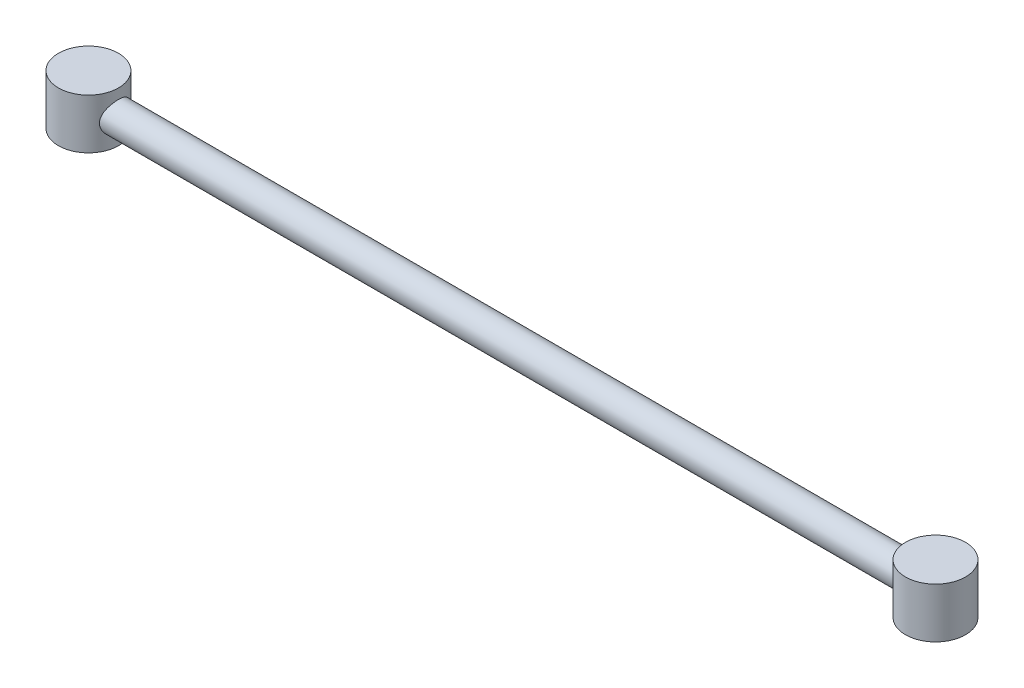
ISO-10303-21;
HEADER;
FILE_DESCRIPTION(('STEP AP214'),'2;1');
FILE_NAME('part.step','',(''),(''),'','','');
FILE_SCHEMA(('AUTOMOTIVE_DESIGN { 1 0 10303 214 1 1 1 1 }'));
ENDSEC;
DATA;
#1=APPLICATION_CONTEXT('core data for automotive mechanical design processes');
#2=APPLICATION_PROTOCOL_DEFINITION('international standard','automotive_design',2000,#1);
#3=PRODUCT_CONTEXT('',#1,'mechanical');
#4=PRODUCT('Part','Part','',(#3));
#5=PRODUCT_RELATED_PRODUCT_CATEGORY('part','',(#4));
#6=PRODUCT_DEFINITION_FORMATION('','',#4);
#7=PRODUCT_DEFINITION_CONTEXT('part definition',#1,'design');
#8=PRODUCT_DEFINITION('design','',#6,#7);
#9=PRODUCT_DEFINITION_SHAPE('','',#8);
#10=(LENGTH_UNIT() NAMED_UNIT(*) SI_UNIT(.MILLI.,.METRE.));
#11=(NAMED_UNIT(*) PLANE_ANGLE_UNIT() SI_UNIT($,.RADIAN.));
#12=(NAMED_UNIT(*) SI_UNIT($,.STERADIAN.) SOLID_ANGLE_UNIT());
#13=UNCERTAINTY_MEASURE_WITH_UNIT(LENGTH_MEASURE(1.E-05),#10,'distance_accuracy_value','');
#14=(GEOMETRIC_REPRESENTATION_CONTEXT(3) GLOBAL_UNCERTAINTY_ASSIGNED_CONTEXT((#13)) GLOBAL_UNIT_ASSIGNED_CONTEXT((#10,
#11,#12)) REPRESENTATION_CONTEXT('',''));
#15=CARTESIAN_POINT('',(0.,0.,0.));
#16=DIRECTION('',(0.,0.,1.));
#17=DIRECTION('',(1.,0.,0.));
#18=AXIS2_PLACEMENT_3D('',#15,#16,#17);
#19=CARTESIAN_POINT('',(-3.175,1.27,0.));
#20=DIRECTION('',(0.,1.,0.));
#21=DIRECTION('',(0.,0.,1.));
#22=AXIS2_PLACEMENT_3D('',#19,#20,#21);
#23=PLANE('',#22);
#24=DIRECTION('',(1.,0.,0.));
#25=VECTOR('',#24,1.);
#26=CARTESIAN_POINT('',(-500000.,1.27,-9.43995365454725));
#27=LINE('',#26,#25);
#28=CARTESIAN_POINT('',(-3.17499999999882,1.27,-9.43995365454725));
#29=VERTEX_POINT('',#28);
#30=CARTESIAN_POINT('',(3.17499999999882,1.27,-9.43995365454725));
#31=VERTEX_POINT('',#30);
#32=EDGE_CURVE('E152',#29,#31,#27,.T.);
#33=ORIENTED_EDGE('',*,*,#32,.T.);
#34=DIRECTION('',(0.,0.,1.));
#35=VECTOR('',#34,1.);
#36=CARTESIAN_POINT('',(3.175,1.27,0.));
#37=LINE('',#36,#35);
#38=CARTESIAN_POINT('',(3.175,1.27,0.));
#39=VERTEX_POINT('',#38);
#40=EDGE_CURVE('E48',#31,#39,#37,.T.);
#41=ORIENTED_EDGE('',*,*,#40,.T.);
#42=DIRECTION('',(1.,0.,0.));
#43=VECTOR('',#42,1.);
#44=CARTESIAN_POINT('',(-3.175,1.27,0.));
#45=LINE('',#44,#43);
#46=CARTESIAN_POINT('',(-3.175,1.27,0.));
#47=VERTEX_POINT('',#46);
#48=EDGE_CURVE('E83',#47,#39,#45,.T.);
#49=ORIENTED_EDGE('',*,*,#48,.F.);
#50=DIRECTION('',(0.,0.,1.));
#51=VECTOR('',#50,1.);
#52=CARTESIAN_POINT('',(-3.175,1.27,0.));
#53=LINE('',#52,#51);
#54=EDGE_CURVE('E84',#29,#47,#53,.T.);
#55=ORIENTED_EDGE('',*,*,#54,.F.);
#56=EDGE_LOOP('',(#33,#41,#49,#55));
#57=FACE_BOUND('',#56,.T.);
#58=CARTESIAN_POINT('',(0.,1.26999999997679,-6.29166923465618));
#59=DIRECTION('',(0.,1.,0.));
#60=DIRECTION('',(0.,0.,1.));
#61=AXIS2_PLACEMENT_3D('',#58,#59,#60);
#62=CIRCLE('',#61,1.27);
#63=CARTESIAN_POINT('',(0.,1.26999999997679,-7.56166923465618));
#64=VERTEX_POINT('',#63);
#65=EDGE_CURVE('E11',#64,#64,#62,.F.);
#66=ORIENTED_EDGE('',*,*,#65,.F.);
#67=EDGE_LOOP('',(#66));
#68=FACE_BOUND('',#67,.T.);
#69=ADVANCED_FACE('F33',(#57,#68),#23,.F.);
#70=CARTESIAN_POINT('',(-3.175,-1.27,0.));
#71=DIRECTION('',(0.,-1.,0.));
#72=DIRECTION('',(0.,0.,-1.));
#73=AXIS2_PLACEMENT_3D('',#70,#71,#72);
#74=PLANE('',#73);
#75=DIRECTION('',(1.,0.,0.));
#76=VECTOR('',#75,1.);
#77=CARTESIAN_POINT('',(-500000.,-1.27,-9.43995365454725));
#78=LINE('',#77,#76);
#79=CARTESIAN_POINT('',(3.17499999999882,-1.27,-9.43995365454725));
#80=VERTEX_POINT('',#79);
#81=CARTESIAN_POINT('',(-3.17499999999882,-1.27,-9.43995365454725));
#82=VERTEX_POINT('',#81);
#83=EDGE_CURVE('E56',#80,#82,#78,.F.);
#84=ORIENTED_EDGE('',*,*,#83,.T.);
#85=DIRECTION('',(0.,0.,-1.));
#86=VECTOR('',#85,1.);
#87=CARTESIAN_POINT('',(-3.175,-1.27,0.));
#88=LINE('',#87,#86);
#89=CARTESIAN_POINT('',(-3.175,-1.27,0.));
#90=VERTEX_POINT('',#89);
#91=EDGE_CURVE('E86',#90,#82,#88,.T.);
#92=ORIENTED_EDGE('',*,*,#91,.F.);
#93=DIRECTION('',(1.,0.,0.));
#94=VECTOR('',#93,1.);
#95=CARTESIAN_POINT('',(-3.175,-1.27,0.));
#96=LINE('',#95,#94);
#97=CARTESIAN_POINT('',(3.175,-1.27,0.));
#98=VERTEX_POINT('',#97);
#99=EDGE_CURVE('E76',#90,#98,#96,.T.);
#100=ORIENTED_EDGE('',*,*,#99,.T.);
#101=DIRECTION('',(0.,0.,-1.));
#102=VECTOR('',#101,1.);
#103=CARTESIAN_POINT('',(3.175,-1.27,0.));
#104=LINE('',#103,#102);
#105=EDGE_CURVE('E96',#98,#80,#104,.T.);
#106=ORIENTED_EDGE('',*,*,#105,.T.);
#107=EDGE_LOOP('',(#84,#92,#100,#106));
#108=FACE_BOUND('',#107,.T.);
#109=CARTESIAN_POINT('',(0.,-1.26999999997679,-6.29166923465618));
#110=DIRECTION('',(0.,-1.,0.));
#111=DIRECTION('',(0.,0.,-1.));
#112=AXIS2_PLACEMENT_3D('',#109,#110,#111);
#113=CIRCLE('',#112,1.27);
#114=CARTESIAN_POINT('',(0.,-1.26999999997679,-7.56166923465618));
#115=VERTEX_POINT('',#114);
#116=EDGE_CURVE('E41',#115,#115,#113,.F.);
#117=ORIENTED_EDGE('',*,*,#116,.F.);
#118=EDGE_LOOP('',(#117));
#119=FACE_BOUND('',#118,.T.);
#120=ADVANCED_FACE('F87',(#108,#119),#74,.F.);
#121=CARTESIAN_POINT('',(268.478,-15.875,0.));
#122=DIRECTION('',(0.,1.,0.));
#123=DIRECTION('',(0.,0.,1.));
#124=AXIS2_PLACEMENT_3D('',#121,#122,#123);
#125=PLANE('',#124);
#126=CARTESIAN_POINT('',(268.478,-15.875,0.));
#127=DIRECTION('',(0.,-1.,0.));
#128=DIRECTION('',(0.,0.,1.));
#129=AXIS2_PLACEMENT_3D('',#126,#127,#128);
#130=CIRCLE('',#129,19.05);
#131=CARTESIAN_POINT('',(268.478,-15.875,19.05));
#132=VERTEX_POINT('',#131);
#133=EDGE_CURVE('E111',#132,#132,#130,.T.);
#134=ORIENTED_EDGE('',*,*,#133,.T.);
#135=EDGE_LOOP('',(#134));
#136=FACE_BOUND('',#135,.T.);
#137=CARTESIAN_POINT('',(268.478,-15.875,0.));
#138=DIRECTION('',(0.,1.,0.));
#139=DIRECTION('',(0.,0.,1.));
#140=AXIS2_PLACEMENT_3D('',#137,#138,#139);
#141=CIRCLE('',#140,12.7);
#142=CARTESIAN_POINT('',(268.478,-15.875,12.7));
#143=VERTEX_POINT('',#142);
#144=EDGE_CURVE('E102',#143,#143,#141,.F.);
#145=ORIENTED_EDGE('',*,*,#144,.F.);
#146=EDGE_LOOP('',(#145));
#147=FACE_BOUND('',#146,.T.);
#148=ADVANCED_FACE('F132',(#136,#147),#125,.F.);
#149=CARTESIAN_POINT('',(-268.478,-15.875,0.));
#150=DIRECTION('',(0.,1.,0.));
#151=DIRECTION('',(0.,0.,1.));
#152=AXIS2_PLACEMENT_3D('',#149,#150,#151);
#153=PLANE('',#152);
#154=CARTESIAN_POINT('',(-268.478,-15.875,0.));
#155=DIRECTION('',(0.,1.,0.));
#156=DIRECTION('',(0.,0.,1.));
#157=AXIS2_PLACEMENT_3D('',#154,#155,#156);
#158=CIRCLE('',#157,19.05);
#159=CARTESIAN_POINT('',(-268.478,-15.875,19.05));
#160=VERTEX_POINT('',#159);
#161=EDGE_CURVE('E165',#160,#160,#158,.T.);
#162=ORIENTED_EDGE('',*,*,#161,.F.);
#163=EDGE_LOOP('',(#162));
#164=FACE_BOUND('',#163,.T.);
#165=CARTESIAN_POINT('',(-268.478,-15.875,0.));
#166=DIRECTION('',(0.,1.,0.));
#167=DIRECTION('',(0.,0.,1.));
#168=AXIS2_PLACEMENT_3D('',#165,#166,#167);
#169=CIRCLE('',#168,12.7);
#170=CARTESIAN_POINT('',(-268.478,-15.875,12.7));
#171=VERTEX_POINT('',#170);
#172=EDGE_CURVE('E112',#171,#171,#169,.F.);
#173=ORIENTED_EDGE('',*,*,#172,.F.);
#174=EDGE_LOOP('',(#173));
#175=FACE_BOUND('',#174,.T.);
#176=ADVANCED_FACE('F184',(#164,#175),#153,.F.);
#177=CARTESIAN_POINT('',(-268.478,15.875,0.));
#178=DIRECTION('',(0.,-1.,0.));
#179=DIRECTION('',(0.,0.,-1.));
#180=AXIS2_PLACEMENT_3D('',#177,#178,#179);
#181=CYLINDRICAL_SURFACE('',#180,19.05);
#182=CARTESIAN_POINT('',(-251.980216057922,0.,-9.525));
#183=CARTESIAN_POINT('',(-251.980214634338,0.248281546165091,-9.52499893158731));
#184=CARTESIAN_POINT('',(-251.974592178614,0.496584709663516,-9.5152793854479));
#185=CARTESIAN_POINT('',(-251.952311035366,0.991277681960141,-9.47652846767449));
#186=CARTESIAN_POINT('',(-251.935647209922,1.23766654594224,-9.44748810539008));
#187=CARTESIAN_POINT('',(-251.891872870738,1.72690457641127,-9.37042405876415));
#188=CARTESIAN_POINT('',(-251.86474597588,1.96974756957878,-9.32237060421729));
#189=CARTESIAN_POINT('',(-251.80100646524,2.44987713557215,-9.2078592239572));
#190=CARTESIAN_POINT('',(-251.764389724928,2.68716124334515,-9.14139329483979));
#191=CARTESIAN_POINT('',(-251.683139350428,3.15322618190933,-8.99123962648128));
#192=CARTESIAN_POINT('',(-251.638553364395,3.38204829384444,-8.90765383569051));
#193=CARTESIAN_POINT('',(-251.542566438745,3.8314829025366,-8.7237802435713));
#194=CARTESIAN_POINT('',(-251.491163029294,4.05209238672965,-8.6234863858136));
#195=CARTESIAN_POINT('',(-251.383004605287,4.48393698188996,-8.40703629023968));
#196=CARTESIAN_POINT('',(-251.326250853952,4.69517428840229,-8.29088379377404));
#197=CARTESIAN_POINT('',(-251.208838616189,5.10745707788947,-8.04346401374653));
#198=CARTESIAN_POINT('',(-251.14818000112,5.3085022247055,-7.91219623211734));
#199=CARTESIAN_POINT('',(-251.019280879606,5.71579775768272,-7.62381683443089));
#200=CARTESIAN_POINT('',(-250.950828148739,5.92110434221265,-7.46546581951747));
#201=CARTESIAN_POINT('',(-250.812843058468,6.31787052737791,-7.1328215507058));
#202=CARTESIAN_POINT('',(-250.743310980617,6.5093336677949,-6.95853239820335));
#203=CARTESIAN_POINT('',(-250.604835542378,6.87766484529038,-6.59472443647305));
#204=CARTESIAN_POINT('',(-250.535892534666,7.0545246226494,-6.40519712647571));
#205=CARTESIAN_POINT('',(-250.400294324002,7.39260099929998,-6.01185007749179));
#206=CARTESIAN_POINT('',(-250.33363946922,7.55381522469563,-5.80802817764742));
#207=CARTESIAN_POINT('',(-250.199844388911,7.86994148490604,-5.37278298407204));
#208=CARTESIAN_POINT('',(-250.132977301563,8.02368632550289,-5.14042525131781));
#209=CARTESIAN_POINT('',(-250.005584842305,8.31082408311721,-4.66193516492724));
#210=CARTESIAN_POINT('',(-249.945056768897,8.44422568096336,-4.41580874826571));
#211=CARTESIAN_POINT('',(-249.832061358994,8.68941833427074,-3.9113001615552));
#212=CARTESIAN_POINT('',(-249.779592062002,8.80121464746687,-3.65292099237303));
#213=CARTESIAN_POINT('',(-249.684274572532,9.00194699005801,-3.12571719778882));
#214=CARTESIAN_POINT('',(-249.641425358192,9.09088544760324,-2.85689368536654));
#215=CARTESIAN_POINT('',(-249.569345188921,9.23927740795149,-2.33040190392418));
#216=CARTESIAN_POINT('',(-249.539362310807,9.30037830763904,-2.07330045246555));
#217=CARTESIAN_POINT('',(-249.489693097287,9.40110896147763,-1.55394008606448));
#218=CARTESIAN_POINT('',(-249.470006314213,9.44073964914621,-1.29168139587093));
#219=CARTESIAN_POINT('',(-249.441508350909,9.4979869279131,-0.76431852253068));
#220=CARTESIAN_POINT('',(-249.432691628503,9.51561473739145,-0.49921585901119));
#221=CARTESIAN_POINT('',(-249.426177295126,9.52864676705275,0.0316650576844548));
#222=CARTESIAN_POINT('',(-249.428479003872,9.52405234690619,0.297443268532658));
#223=CARTESIAN_POINT('',(-249.443445830691,9.49407808105549,0.804258022659698));
#224=CARTESIAN_POINT('',(-249.455191009603,9.47054314914934,1.04543361409006));
#225=CARTESIAN_POINT('',(-249.487594508987,9.40528730170593,1.52468793779052));
#226=CARTESIAN_POINT('',(-249.508252201943,9.36356766652482,1.76276688687513));
#227=CARTESIAN_POINT('',(-249.557986291883,9.262396120129,2.23422861277622));
#228=CARTESIAN_POINT('',(-249.587062963115,9.20294363126585,2.46761123634529));
#229=CARTESIAN_POINT('',(-249.65295673925,9.06691323219252,2.92820475287215));
#230=CARTESIAN_POINT('',(-249.689774122167,8.99033470688245,3.15541542382887));
#231=CARTESIAN_POINT('',(-249.770873428015,8.81960511649784,3.60539471515004));
#232=CARTESIAN_POINT('',(-249.81524992837,8.72522954178945,3.82806111323092));
#233=CARTESIAN_POINT('',(-249.910124238517,8.52040758485652,4.26455898990727));
#234=CARTESIAN_POINT('',(-249.96062421704,8.40995550608297,4.47838730218702));
#235=CARTESIAN_POINT('',(-250.119695847882,8.05575473491029,5.10494218255635));
#236=CARTESIAN_POINT('',(-250.235890071647,7.78905769056075,5.50300988352719));
#237=CARTESIAN_POINT('',(-250.49060253376,7.17323939319794,6.28826701689851));
#238=CARTESIAN_POINT('',(-250.630192757884,6.81870984681844,6.67087124951463));
#239=CARTESIAN_POINT('',(-250.839055866412,6.24398190762096,7.1976429664399));
#240=CARTESIAN_POINT('',(-250.908641228975,6.04508700313851,7.36548461300317));
#241=CARTESIAN_POINT('',(-251.04589779904,5.63373015326947,7.68468913396525));
#242=CARTESIAN_POINT('',(-251.113568716143,5.42126616537583,7.83604951817745));
#243=CARTESIAN_POINT('',(-251.249337409067,4.96982713462606,8.1304140821555));
#244=CARTESIAN_POINT('',(-251.317186410535,4.73002555004584,8.27226715358055));
#245=CARTESIAN_POINT('',(-251.446325486983,4.2376242347197,8.5349859642748));
#246=CARTESIAN_POINT('',(-251.50761850808,3.98503032840596,8.65586114589579));
#247=CARTESIAN_POINT('',(-251.621403771724,3.46862123853846,8.87541314764735));
#248=CARTESIAN_POINT('',(-251.673901212293,3.20481279896961,8.97410309070607));
#249=CARTESIAN_POINT('',(-251.768010035655,2.66772029026711,9.14814442787226));
#250=CARTESIAN_POINT('',(-251.809622902703,2.3944375188451,9.2234990043216));
#251=CARTESIAN_POINT('',(-251.877330291768,1.86260924212227,9.34476848380948));
#252=CARTESIAN_POINT('',(-251.904392816104,1.60461066000886,9.3925422818087));
#253=CARTESIAN_POINT('',(-251.946633459519,1.08458722855596,9.46669192105021));
#254=CARTESIAN_POINT('',(-251.961812250193,0.822562607596753,9.49306897150749));
#255=CARTESIAN_POINT('',(-251.979632907515,0.296960263774773,9.52400673855615));
#256=CARTESIAN_POINT('',(-251.982282348152,0.0333835756553705,9.52858063516221));
#257=CARTESIAN_POINT('',(-251.974948012871,-0.493054812364364,9.51587268741122));
#258=CARTESIAN_POINT('',(-251.964965089688,-0.755916559325723,9.4985923183037));
#259=CARTESIAN_POINT('',(-251.934571700407,-1.24984183164056,9.4455429123493));
#260=CARTESIAN_POINT('',(-251.915426106823,-1.48122860534284,9.41201151144323));
#261=CARTESIAN_POINT('',(-251.868101367958,-1.94009181578588,9.32824106377493));
#262=CARTESIAN_POINT('',(-251.839919231959,-2.16756693163329,9.27799648544273));
#263=CARTESIAN_POINT('',(-251.775404706437,-2.61711490165282,9.16134514481222));
#264=CARTESIAN_POINT('',(-251.739073404716,-2.83918847247556,9.0949405395553));
#265=CARTESIAN_POINT('',(-251.659319672339,-3.27681368985307,8.94659535954326));
#266=CARTESIAN_POINT('',(-251.615894430246,-3.49236271032068,8.86464862312294));
#267=CARTESIAN_POINT('',(-251.472460876698,-4.14703077843408,8.58828310103961));
#268=CARTESIAN_POINT('',(-251.362394365924,-4.57359334725294,8.36867208294313));
#269=CARTESIAN_POINT('',(-251.12760622104,-5.38620665717053,7.87032062576456));
#270=CARTESIAN_POINT('',(-251.002877073304,-5.77223643441245,7.59154981178829));
#271=CARTESIAN_POINT('',(-250.805233000209,-6.33927802527086,7.1141120246753));
#272=CARTESIAN_POINT('',(-250.73346169622,-6.53623922264036,6.93358198085581));
#273=CARTESIAN_POINT('',(-250.590699205549,-6.91442832649911,6.55649001697002));
#274=CARTESIAN_POINT('',(-250.519707794043,-7.09566087698931,6.35993286250077));
#275=CARTESIAN_POINT('',(-250.380274163356,-7.44149624211217,5.95158869041745));
#276=CARTESIAN_POINT('',(-250.311833890263,-7.60608651903543,5.73979039325583));
#277=CARTESIAN_POINT('',(-250.179337309893,-7.91732288110876,5.30223209432864));
#278=CARTESIAN_POINT('',(-250.115279142015,-8.06397660305826,5.07647809651308));
#279=CARTESIAN_POINT('',(-249.991550146129,-8.34193371088852,4.60591098679507));
#280=CARTESIAN_POINT('',(-249.932042521368,-8.4727215226651,4.36074958086053));
#281=CARTESIAN_POINT('',(-249.821063002567,-8.71296605151928,3.85841355184558));
#282=CARTESIAN_POINT('',(-249.769591377853,-8.82242205369091,3.60123852650335));
#283=CARTESIAN_POINT('',(-249.676243482827,-9.01868185771797,3.07689828485042));
#284=CARTESIAN_POINT('',(-249.634360360692,-9.10550184118274,2.80974036199149));
#285=CARTESIAN_POINT('',(-249.561443084555,-9.25546065676157,2.26741988318845));
#286=CARTESIAN_POINT('',(-249.530407644096,-9.31860229702243,1.99225828061881));
#287=CARTESIAN_POINT('',(-249.482484559894,-9.41564302918796,1.46190176592619));
#288=CARTESIAN_POINT('',(-249.464559761508,-9.45169433108279,1.20719251144052));
#289=CARTESIAN_POINT('',(-249.438963794645,-9.50307983029511,0.69518402672395));
#290=CARTESIAN_POINT('',(-249.431291975417,-9.51841534243839,0.437884961912026));
#291=CARTESIAN_POINT('',(-249.42641599515,-9.52816848668715,-0.077129583007611));
#292=CARTESIAN_POINT('',(-249.429208715491,-9.52259235084093,-0.334844916177599));
#293=CARTESIAN_POINT('',(-249.445177101564,-9.49060934636438,-0.848650424625073));
#294=CARTESIAN_POINT('',(-249.458352481461,-9.46420305118774,-1.10474064444624));
#295=CARTESIAN_POINT('',(-249.493513987565,-9.39333314066668,-1.59639169532538));
#296=CARTESIAN_POINT('',(-249.514859065487,-9.35018071859178,-1.8321892255504));
#297=CARTESIAN_POINT('',(-249.565786360252,-9.24645833597861,-2.29909579001806));
#298=CARTESIAN_POINT('',(-249.595371387572,-9.1858824324199,-2.53020319565023));
#299=CARTESIAN_POINT('',(-249.662089140204,-9.04794268289483,-2.98614719861168));
#300=CARTESIAN_POINT('',(-249.699219653879,-8.97058375570618,-3.21098561151828));
#301=CARTESIAN_POINT('',(-249.780230096608,-8.79973753015809,-3.65328284258561));
#302=CARTESIAN_POINT('',(-249.824112651175,-8.70624395615957,-3.87073874975688));
#303=CARTESIAN_POINT('',(-249.919670121969,-8.4996162505278,-4.30611728340987));
#304=CARTESIAN_POINT('',(-249.971596439848,-8.38581773795988,-4.52366922494024));
#305=CARTESIAN_POINT('',(-250.080624158231,-8.14238343895832,-4.94845122759403));
#306=CARTESIAN_POINT('',(-250.137727321186,-8.01274225363521,-5.15567773594444));
#307=CARTESIAN_POINT('',(-250.255874683188,-7.73849411507185,-5.55884758533126));
#308=CARTESIAN_POINT('',(-250.316919668719,-7.59388417172665,-5.75478865981648));
#309=CARTESIAN_POINT('',(-250.44164946522,-7.29055405422973,-6.13453422664671));
#310=CARTESIAN_POINT('',(-250.505334422572,-7.1318330970862,-6.3183380445323));
#311=CARTESIAN_POINT('',(-250.640423282104,-6.78456675143889,-6.69077030582319));
#312=CARTESIAN_POINT('',(-250.711963355214,-6.59462570539112,-6.87805035111036));
#313=CARTESIAN_POINT('',(-250.854734322959,-6.19971753017747,-7.23603060277861));
#314=CARTESIAN_POINT('',(-250.925965297859,-5.99475458414294,-7.40673539430031));
#315=CARTESIAN_POINT('',(-251.066289685264,-5.57053683585024,-7.73085141575446));
#316=CARTESIAN_POINT('',(-251.135380896885,-5.35126799486772,-7.88424524260695));
#317=CARTESIAN_POINT('',(-251.269373070482,-4.89963939924097,-8.17257254916999));
#318=CARTESIAN_POINT('',(-251.334273448741,-4.66727782938853,-8.30750346020164));
#319=CARTESIAN_POINT('',(-251.459828509215,-4.18302333545032,-8.56183982242187));
#320=CARTESIAN_POINT('',(-251.520280965149,-3.93074339845336,-8.68061055998699));
#321=CARTESIAN_POINT('',(-251.632319455686,-3.41516179685381,-8.89608358021233));
#322=CARTESIAN_POINT('',(-251.683910053438,-3.15186589197986,-8.99279722897105));
#323=CARTESIAN_POINT('',(-251.776062987331,-2.61669741389251,-9.16281286636608));
#324=CARTESIAN_POINT('',(-251.816653653656,-2.34484892494134,-9.2361750831529));
#325=CARTESIAN_POINT('',(-251.8851687241,-1.79433328982362,-9.35870783383677));
#326=CARTESIAN_POINT('',(-251.91310198295,-1.51567105462583,-9.40789528170021));
#327=CARTESIAN_POINT('',(-251.949314285377,-1.03060923634938,-9.47132284545955));
#328=CARTESIAN_POINT('',(-251.960874297413,-0.825199974914032,-9.49143255701204));
#329=CARTESIAN_POINT('',(-251.976326032497,-0.413198850893152,-9.51827202636567));
#330=CARTESIAN_POINT('',(-251.980217242555,-0.206606910121221,-9.52500088907713));
#331=CARTESIAN_POINT('',(-251.980216057922,0.,-9.525));
#332=B_SPLINE_CURVE_WITH_KNOTS('',3,(#182,#183,#184,#185,#186,#187,#188,#189,#190,#191,#192,
#193,#194,#195,#196,#197,#198,#199,#200,#201,#202,#203,#204,#205,#206,#207,#208,#209,#210,#211,
#212,#213,#214,#215,#216,#217,#218,#219,#220,#221,#222,#223,#224,#225,#226,#227,#228,#229,#230,
#231,#232,#233,#234,#235,#236,#237,#238,#239,#240,#241,#242,#243,#244,#245,#246,#247,#248,#249,
#250,#251,#252,#253,#254,#255,#256,#257,#258,#259,#260,#261,#262,#263,#264,#265,#266,#267,#268,
#269,#270,#271,#272,#273,#274,#275,#276,#277,#278,#279,#280,#281,#282,#283,#284,#285,#286,#287,
#288,#289,#290,#291,#292,#293,#294,#295,#296,#297,#298,#299,#300,#301,#302,#303,#304,#305,#306,
#307,#308,#309,#310,#311,#312,#313,#314,#315,#316,#317,#318,#319,#320,#321,#322,#323,#324,#325,
#326,#327,#328,#329,#330,#331),.UNSPECIFIED.,.T.,.F.,(4,2,2,2,2,2,2,2,2,2,2,2,2,2,2,2,2,2,2,2,2,
2,2,2,2,2,2,2,2,2,2,2,2,2,2,2,2,2,2,2,2,2,2,2,2,2,2,2,2,2,2,2,2,2,2,2,2,2,2,2,2,2,2,2,2,2,2,2,2,
2,2,2,2,2,4),(0.,0.744630942575213,1.48960863050979,2.23575743074926,2.98223107195607,
3.72438238352836,4.46680330177291,5.20904937066322,5.95131990448137,6.75495685854612,
7.5583875897944,8.36226967546047,9.16627354389065,10.0247554563672,10.8828700078322,
11.7407754699019,12.5985897604644,13.3953819043316,14.1921394011651,14.9884904973314,
15.7847928692512,16.5117502871139,17.2386565293223,17.9655864531178,18.6925424895725,
19.4293704425949,20.1664601217531,21.639764701731,23.2523369248703,24.0598205153886,
24.8674259414044,25.7266114200415,26.5854091622663,27.4436975671282,28.301868872,
29.0920757081682,29.8822378835048,30.6719223448851,31.4615535022806,32.1645098282016,
32.8676990438615,33.5707944492153,34.2741691810373,35.744661919173,37.2159114989435,
38.04507396819,38.8739907821454,39.7035274918176,40.5327097731603,41.3840731348777,
42.2354650239507,43.0862466068973,43.9369272589763,44.7095224731558,45.4820686486128,
46.2543846096729,47.0266793096386,47.7478454249335,48.4692578169461,49.1904590619615,
49.9119414560973,50.6639962457883,51.4163080402785,52.1687704049268,52.9212745482903,
53.7488597646167,54.5762153935016,55.4043955073206,56.232690725953,57.0874821229827,
57.9418320426025,58.7939602191363,59.6454913493029,60.2650928072871,60.8847357110888),.UNSPECIFIED.);
#333=CARTESIAN_POINT('',(-251.980216057922,0.,-9.525));
#334=VERTEX_POINT('',#333);
#335=EDGE_CURVE('E168',#334,#334,#332,.T.);
#336=ORIENTED_EDGE('',*,*,#335,.F.);
#337=EDGE_LOOP('',(#336));
#338=FACE_BOUND('',#337,.T.);
#339=CARTESIAN_POINT('',(-268.478,15.875,0.));
#340=DIRECTION('',(0.,1.,0.));
#341=DIRECTION('',(0.,0.,1.));
#342=AXIS2_PLACEMENT_3D('',#339,#340,#341);
#343=CIRCLE('',#342,19.05);
#344=CARTESIAN_POINT('',(-268.478,15.875,19.05));
#345=VERTEX_POINT('',#344);
#346=EDGE_CURVE('E160',#345,#345,#343,.T.);
#347=ORIENTED_EDGE('',*,*,#346,.F.);
#348=EDGE_LOOP('',(#347));
#349=FACE_BOUND('',#348,.T.);
#350=ORIENTED_EDGE('',*,*,#161,.T.);
#351=EDGE_LOOP('',(#350));
#352=FACE_BOUND('',#351,.T.);
#353=ADVANCED_FACE('F35',(#338,#349,#352),#181,.T.);
#354=CARTESIAN_POINT('',(-268.478,15.875,0.));
#355=DIRECTION('',(0.,1.,0.));
#356=DIRECTION('',(0.,0.,1.));
#357=AXIS2_PLACEMENT_3D('',#354,#355,#356);
#358=PLANE('',#357);
#359=ORIENTED_EDGE('',*,*,#346,.T.);
#360=EDGE_LOOP('',(#359));
#361=FACE_BOUND('',#360,.T.);
#362=ADVANCED_FACE('F181',(#361),#358,.T.);
#363=CARTESIAN_POINT('',(-500000.,0.,0.));
#364=DIRECTION('',(1.,0.,0.));
#365=DIRECTION('',(0.,0.,-1.));
#366=AXIS2_PLACEMENT_3D('',#363,#364,#365);
#367=CYLINDRICAL_SURFACE('',#366,9.525);
#368=CARTESIAN_POINT('',(-3.17499999999882,0.,0.));
#369=DIRECTION('',(-1.,0.,0.));
#370=DIRECTION('',(0.,0.,1.));
#371=AXIS2_PLACEMENT_3D('',#368,#369,#370);
#372=CIRCLE('',#371,9.525);
#373=EDGE_CURVE('E151',#82,#29,#372,.F.);
#374=ORIENTED_EDGE('',*,*,#373,.F.);
#375=ORIENTED_EDGE('',*,*,#83,.F.);
#376=CARTESIAN_POINT('',(3.17499999999882,0.,0.));
#377=DIRECTION('',(-1.,0.,0.));
#378=DIRECTION('',(0.,0.,1.));
#379=AXIS2_PLACEMENT_3D('',#376,#377,#378);
#380=CIRCLE('',#379,9.525);
#381=EDGE_CURVE('E157',#80,#31,#380,.F.);
#382=ORIENTED_EDGE('',*,*,#381,.T.);
#383=ORIENTED_EDGE('',*,*,#32,.F.);
#384=EDGE_LOOP('',(#374,#375,#382,#383));
#385=FACE_BOUND('',#384,.T.);
#386=ORIENTED_EDGE('',*,*,#335,.T.);
#387=EDGE_LOOP('',(#386));
#388=FACE_BOUND('',#387,.T.);
#389=CARTESIAN_POINT('',(251.980216057922,0.,-9.525));
#390=CARTESIAN_POINT('',(251.980214634338,0.248281546165091,-9.52499893158731));
#391=CARTESIAN_POINT('',(251.974592178614,0.496584709663516,-9.5152793854479));
#392=CARTESIAN_POINT('',(251.952311035366,0.991277681960141,-9.47652846767449));
#393=CARTESIAN_POINT('',(251.935647209922,1.23766654594224,-9.44748810539008));
#394=CARTESIAN_POINT('',(251.891872870738,1.72690457641127,-9.37042405876415));
#395=CARTESIAN_POINT('',(251.86474597588,1.96974756957878,-9.32237060421729));
#396=CARTESIAN_POINT('',(251.80100646524,2.44987713557215,-9.2078592239572));
#397=CARTESIAN_POINT('',(251.764389724928,2.68716124334515,-9.14139329483979));
#398=CARTESIAN_POINT('',(251.683139350428,3.15322618190933,-8.99123962648128));
#399=CARTESIAN_POINT('',(251.638553364395,3.38204829384444,-8.90765383569051));
#400=CARTESIAN_POINT('',(251.542566438745,3.8314829025366,-8.7237802435713));
#401=CARTESIAN_POINT('',(251.491163029294,4.05209238672965,-8.6234863858136));
#402=CARTESIAN_POINT('',(251.383004605287,4.48393698188996,-8.40703629023968));
#403=CARTESIAN_POINT('',(251.326250853952,4.69517428840229,-8.29088379377404));
#404=CARTESIAN_POINT('',(251.208838616189,5.10745707788947,-8.04346401374653));
#405=CARTESIAN_POINT('',(251.14818000112,5.3085022247055,-7.91219623211734));
#406=CARTESIAN_POINT('',(251.019280879606,5.71579775768272,-7.62381683443089));
#407=CARTESIAN_POINT('',(250.950828148739,5.92110434221265,-7.46546581951747));
#408=CARTESIAN_POINT('',(250.812843058468,6.31787052737791,-7.1328215507058));
#409=CARTESIAN_POINT('',(250.743310980617,6.5093336677949,-6.95853239820335));
#410=CARTESIAN_POINT('',(250.604835542378,6.87766484529038,-6.59472443647305));
#411=CARTESIAN_POINT('',(250.535892534666,7.0545246226494,-6.40519712647571));
#412=CARTESIAN_POINT('',(250.400294324002,7.39260099929998,-6.01185007749179));
#413=CARTESIAN_POINT('',(250.33363946922,7.55381522469563,-5.80802817764742));
#414=CARTESIAN_POINT('',(250.199844388911,7.86994148490604,-5.37278298407204));
#415=CARTESIAN_POINT('',(250.132977301563,8.02368632550289,-5.14042525131781));
#416=CARTESIAN_POINT('',(250.005584842305,8.31082408311721,-4.66193516492724));
#417=CARTESIAN_POINT('',(249.945056768897,8.44422568096336,-4.41580874826571));
#418=CARTESIAN_POINT('',(249.832061358994,8.68941833427074,-3.9113001615552));
#419=CARTESIAN_POINT('',(249.779592062002,8.80121464746687,-3.65292099237303));
#420=CARTESIAN_POINT('',(249.684274572532,9.00194699005801,-3.12571719778882));
#421=CARTESIAN_POINT('',(249.641425358192,9.09088544760324,-2.85689368536654));
#422=CARTESIAN_POINT('',(249.569345188921,9.23927740795149,-2.33040190392418));
#423=CARTESIAN_POINT('',(249.539362310807,9.30037830763904,-2.07330045246555));
#424=CARTESIAN_POINT('',(249.489693097287,9.40110896147763,-1.55394008606448));
#425=CARTESIAN_POINT('',(249.470006314213,9.44073964914621,-1.29168139587093));
#426=CARTESIAN_POINT('',(249.441508350909,9.4979869279131,-0.76431852253068));
#427=CARTESIAN_POINT('',(249.432691628503,9.51561473739145,-0.49921585901119));
#428=CARTESIAN_POINT('',(249.426177295126,9.52864676705275,0.0316650576844548));
#429=CARTESIAN_POINT('',(249.428479003872,9.52405234690619,0.297443268532658));
#430=CARTESIAN_POINT('',(249.443445830691,9.49407808105549,0.804258022659698));
#431=CARTESIAN_POINT('',(249.455191009603,9.47054314914934,1.04543361409006));
#432=CARTESIAN_POINT('',(249.487594508987,9.40528730170593,1.52468793779052));
#433=CARTESIAN_POINT('',(249.508252201943,9.36356766652482,1.76276688687513));
#434=CARTESIAN_POINT('',(249.557986291883,9.262396120129,2.23422861277622));
#435=CARTESIAN_POINT('',(249.587062963115,9.20294363126585,2.46761123634529));
#436=CARTESIAN_POINT('',(249.65295673925,9.06691323219252,2.92820475287215));
#437=CARTESIAN_POINT('',(249.689774122167,8.99033470688245,3.15541542382887));
#438=CARTESIAN_POINT('',(249.770873428015,8.81960511649784,3.60539471515004));
#439=CARTESIAN_POINT('',(249.81524992837,8.72522954178945,3.82806111323092));
#440=CARTESIAN_POINT('',(249.910124238517,8.52040758485652,4.26455898990727));
#441=CARTESIAN_POINT('',(249.96062421704,8.40995550608297,4.47838730218702));
#442=CARTESIAN_POINT('',(250.119695847882,8.05575473491029,5.10494218255635));
#443=CARTESIAN_POINT('',(250.235890071647,7.78905769056075,5.50300988352719));
#444=CARTESIAN_POINT('',(250.49060253376,7.17323939319794,6.28826701689851));
#445=CARTESIAN_POINT('',(250.630192757884,6.81870984681844,6.67087124951463));
#446=CARTESIAN_POINT('',(250.839055866412,6.24398190762096,7.1976429664399));
#447=CARTESIAN_POINT('',(250.908641228975,6.04508700313851,7.36548461300317));
#448=CARTESIAN_POINT('',(251.04589779904,5.63373015326947,7.68468913396525));
#449=CARTESIAN_POINT('',(251.113568716143,5.42126616537583,7.83604951817745));
#450=CARTESIAN_POINT('',(251.249337409067,4.96982713462606,8.1304140821555));
#451=CARTESIAN_POINT('',(251.317186410535,4.73002555004584,8.27226715358055));
#452=CARTESIAN_POINT('',(251.446325486983,4.2376242347197,8.5349859642748));
#453=CARTESIAN_POINT('',(251.50761850808,3.98503032840596,8.65586114589579));
#454=CARTESIAN_POINT('',(251.621403771724,3.46862123853846,8.87541314764735));
#455=CARTESIAN_POINT('',(251.673901212293,3.20481279896961,8.97410309070607));
#456=CARTESIAN_POINT('',(251.768010035655,2.66772029026711,9.14814442787226));
#457=CARTESIAN_POINT('',(251.809622902703,2.3944375188451,9.2234990043216));
#458=CARTESIAN_POINT('',(251.877330291768,1.86260924212227,9.34476848380948));
#459=CARTESIAN_POINT('',(251.904392816104,1.60461066000886,9.3925422818087));
#460=CARTESIAN_POINT('',(251.946633459519,1.08458722855596,9.46669192105021));
#461=CARTESIAN_POINT('',(251.961812250193,0.822562607596753,9.49306897150749));
#462=CARTESIAN_POINT('',(251.979632907515,0.296960263774773,9.52400673855615));
#463=CARTESIAN_POINT('',(251.982282348152,0.0333835756553705,9.52858063516221));
#464=CARTESIAN_POINT('',(251.974948012871,-0.493054812364364,9.51587268741122));
#465=CARTESIAN_POINT('',(251.964965089688,-0.755916559325723,9.4985923183037));
#466=CARTESIAN_POINT('',(251.934571700407,-1.24984183164056,9.4455429123493));
#467=CARTESIAN_POINT('',(251.915426106823,-1.48122860534284,9.41201151144323));
#468=CARTESIAN_POINT('',(251.868101367958,-1.94009181578588,9.32824106377493));
#469=CARTESIAN_POINT('',(251.839919231959,-2.16756693163329,9.27799648544273));
#470=CARTESIAN_POINT('',(251.775404706437,-2.61711490165282,9.16134514481222));
#471=CARTESIAN_POINT('',(251.739073404716,-2.83918847247556,9.0949405395553));
#472=CARTESIAN_POINT('',(251.659319672339,-3.27681368985307,8.94659535954326));
#473=CARTESIAN_POINT('',(251.615894430246,-3.49236271032068,8.86464862312294));
#474=CARTESIAN_POINT('',(251.472460876698,-4.14703077843408,8.58828310103961));
#475=CARTESIAN_POINT('',(251.362394365924,-4.57359334725294,8.36867208294313));
#476=CARTESIAN_POINT('',(251.12760622104,-5.38620665717053,7.87032062576456));
#477=CARTESIAN_POINT('',(251.002877073304,-5.77223643441245,7.59154981178829));
#478=CARTESIAN_POINT('',(250.805233000209,-6.33927802527086,7.1141120246753));
#479=CARTESIAN_POINT('',(250.73346169622,-6.53623922264036,6.93358198085581));
#480=CARTESIAN_POINT('',(250.590699205549,-6.91442832649911,6.55649001697002));
#481=CARTESIAN_POINT('',(250.519707794043,-7.09566087698931,6.35993286250077));
#482=CARTESIAN_POINT('',(250.380274163356,-7.44149624211217,5.95158869041745));
#483=CARTESIAN_POINT('',(250.311833890263,-7.60608651903543,5.73979039325583));
#484=CARTESIAN_POINT('',(250.179337309893,-7.91732288110876,5.30223209432864));
#485=CARTESIAN_POINT('',(250.115279142015,-8.06397660305826,5.07647809651308));
#486=CARTESIAN_POINT('',(249.991550146129,-8.34193371088852,4.60591098679507));
#487=CARTESIAN_POINT('',(249.932042521368,-8.4727215226651,4.36074958086053));
#488=CARTESIAN_POINT('',(249.821063002567,-8.71296605151928,3.85841355184558));
#489=CARTESIAN_POINT('',(249.769591377853,-8.82242205369091,3.60123852650335));
#490=CARTESIAN_POINT('',(249.676243482827,-9.01868185771797,3.07689828485042));
#491=CARTESIAN_POINT('',(249.634360360692,-9.10550184118274,2.80974036199149));
#492=CARTESIAN_POINT('',(249.561443084555,-9.25546065676157,2.26741988318845));
#493=CARTESIAN_POINT('',(249.530407644096,-9.31860229702243,1.99225828061881));
#494=CARTESIAN_POINT('',(249.482484559894,-9.41564302918796,1.46190176592619));
#495=CARTESIAN_POINT('',(249.464559761508,-9.45169433108279,1.20719251144052));
#496=CARTESIAN_POINT('',(249.438963794645,-9.50307983029511,0.69518402672395));
#497=CARTESIAN_POINT('',(249.431291975417,-9.51841534243839,0.437884961912026));
#498=CARTESIAN_POINT('',(249.42641599515,-9.52816848668715,-0.077129583007611));
#499=CARTESIAN_POINT('',(249.429208715491,-9.52259235084093,-0.334844916177599));
#500=CARTESIAN_POINT('',(249.445177101564,-9.49060934636438,-0.848650424625073));
#501=CARTESIAN_POINT('',(249.458352481461,-9.46420305118774,-1.10474064444624));
#502=CARTESIAN_POINT('',(249.493513987565,-9.39333314066668,-1.59639169532538));
#503=CARTESIAN_POINT('',(249.514859065487,-9.35018071859178,-1.8321892255504));
#504=CARTESIAN_POINT('',(249.565786360252,-9.24645833597861,-2.29909579001806));
#505=CARTESIAN_POINT('',(249.595371387572,-9.1858824324199,-2.53020319565023));
#506=CARTESIAN_POINT('',(249.662089140204,-9.04794268289483,-2.98614719861168));
#507=CARTESIAN_POINT('',(249.699219653879,-8.97058375570618,-3.21098561151828));
#508=CARTESIAN_POINT('',(249.780230096608,-8.79973753015809,-3.65328284258561));
#509=CARTESIAN_POINT('',(249.824112651175,-8.70624395615957,-3.87073874975688));
#510=CARTESIAN_POINT('',(249.919670121969,-8.4996162505278,-4.30611728340987));
#511=CARTESIAN_POINT('',(249.971596439848,-8.38581773795988,-4.52366922494024));
#512=CARTESIAN_POINT('',(250.080624158231,-8.14238343895832,-4.94845122759403));
#513=CARTESIAN_POINT('',(250.137727321186,-8.01274225363521,-5.15567773594444));
#514=CARTESIAN_POINT('',(250.255874683188,-7.73849411507185,-5.55884758533126));
#515=CARTESIAN_POINT('',(250.316919668719,-7.59388417172665,-5.75478865981648));
#516=CARTESIAN_POINT('',(250.44164946522,-7.29055405422973,-6.13453422664671));
#517=CARTESIAN_POINT('',(250.505334422572,-7.1318330970862,-6.3183380445323));
#518=CARTESIAN_POINT('',(250.640423282104,-6.78456675143889,-6.69077030582319));
#519=CARTESIAN_POINT('',(250.711963355214,-6.59462570539112,-6.87805035111036));
#520=CARTESIAN_POINT('',(250.854734322959,-6.19971753017747,-7.23603060277861));
#521=CARTESIAN_POINT('',(250.925965297859,-5.99475458414294,-7.40673539430031));
#522=CARTESIAN_POINT('',(251.066289685264,-5.57053683585024,-7.73085141575446));
#523=CARTESIAN_POINT('',(251.135380896885,-5.35126799486772,-7.88424524260695));
#524=CARTESIAN_POINT('',(251.269373070482,-4.89963939924097,-8.17257254916999));
#525=CARTESIAN_POINT('',(251.334273448741,-4.66727782938853,-8.30750346020164));
#526=CARTESIAN_POINT('',(251.459828509215,-4.18302333545032,-8.56183982242187));
#527=CARTESIAN_POINT('',(251.520280965149,-3.93074339845336,-8.68061055998699));
#528=CARTESIAN_POINT('',(251.632319455686,-3.41516179685381,-8.89608358021233));
#529=CARTESIAN_POINT('',(251.683910053438,-3.15186589197986,-8.99279722897105));
#530=CARTESIAN_POINT('',(251.776062987331,-2.61669741389251,-9.16281286636608));
#531=CARTESIAN_POINT('',(251.816653653656,-2.34484892494134,-9.2361750831529));
#532=CARTESIAN_POINT('',(251.8851687241,-1.79433328982362,-9.35870783383677));
#533=CARTESIAN_POINT('',(251.91310198295,-1.51567105462583,-9.40789528170021));
#534=CARTESIAN_POINT('',(251.949314285377,-1.03060923634938,-9.47132284545955));
#535=CARTESIAN_POINT('',(251.960874297413,-0.825199974914032,-9.49143255701204));
#536=CARTESIAN_POINT('',(251.976326032497,-0.413198850893152,-9.51827202636567));
#537=CARTESIAN_POINT('',(251.980217242555,-0.206606910121221,-9.52500088907713));
#538=CARTESIAN_POINT('',(251.980216057922,0.,-9.525));
#539=B_SPLINE_CURVE_WITH_KNOTS('',3,(#389,#390,#391,#392,#393,#394,#395,#396,#397,#398,#399,
#400,#401,#402,#403,#404,#405,#406,#407,#408,#409,#410,#411,#412,#413,#414,#415,#416,#417,#418,
#419,#420,#421,#422,#423,#424,#425,#426,#427,#428,#429,#430,#431,#432,#433,#434,#435,#436,#437,
#438,#439,#440,#441,#442,#443,#444,#445,#446,#447,#448,#449,#450,#451,#452,#453,#454,#455,#456,
#457,#458,#459,#460,#461,#462,#463,#464,#465,#466,#467,#468,#469,#470,#471,#472,#473,#474,#475,
#476,#477,#478,#479,#480,#481,#482,#483,#484,#485,#486,#487,#488,#489,#490,#491,#492,#493,#494,
#495,#496,#497,#498,#499,#500,#501,#502,#503,#504,#505,#506,#507,#508,#509,#510,#511,#512,#513,
#514,#515,#516,#517,#518,#519,#520,#521,#522,#523,#524,#525,#526,#527,#528,#529,#530,#531,#532,
#533,#534,#535,#536,#537,#538),.UNSPECIFIED.,.T.,.F.,(4,2,2,2,2,2,2,2,2,2,2,2,2,2,2,2,2,2,2,2,2,
2,2,2,2,2,2,2,2,2,2,2,2,2,2,2,2,2,2,2,2,2,2,2,2,2,2,2,2,2,2,2,2,2,2,2,2,2,2,2,2,2,2,2,2,2,2,2,2,
2,2,2,2,2,4),(0.,0.744630942575213,1.48960863050979,2.23575743074926,2.98223107195607,
3.72438238352836,4.46680330177291,5.20904937066322,5.95131990448137,6.75495685854612,
7.5583875897944,8.36226967546047,9.16627354389065,10.0247554563672,10.8828700078322,
11.7407754699019,12.5985897604644,13.3953819043316,14.1921394011651,14.9884904973314,
15.7847928692512,16.5117502871139,17.2386565293223,17.9655864531178,18.6925424895725,
19.4293704425949,20.1664601217531,21.639764701731,23.2523369248703,24.0598205153886,
24.8674259414044,25.7266114200415,26.5854091622663,27.4436975671282,28.301868872,
29.0920757081682,29.8822378835048,30.6719223448851,31.4615535022806,32.1645098282016,
32.8676990438615,33.5707944492153,34.2741691810373,35.744661919173,37.2159114989435,
38.04507396819,38.8739907821454,39.7035274918176,40.5327097731603,41.3840731348777,
42.2354650239507,43.0862466068973,43.9369272589763,44.7095224731558,45.4820686486128,
46.2543846096729,47.0266793096386,47.7478454249335,48.4692578169461,49.1904590619615,
49.9119414560973,50.6639962457883,51.4163080402785,52.1687704049268,52.9212745482903,
53.7488597646167,54.5762153935016,55.4043955073206,56.232690725953,57.0874821229827,
57.9418320426025,58.7939602191363,59.6454913493029,60.2650928072871,60.8847357110888),.UNSPECIFIED.);
#540=CARTESIAN_POINT('',(251.980216057922,0.,-9.525));
#541=VERTEX_POINT('',#540);
#542=EDGE_CURVE('E104',#541,#541,#539,.T.);
#543=ORIENTED_EDGE('',*,*,#542,.F.);
#544=EDGE_LOOP('',(#543));
#545=FACE_BOUND('',#544,.T.);
#546=ADVANCED_FACE('F176',(#385,#388,#545),#367,.T.);
#547=CARTESIAN_POINT('',(268.478,15.875,0.));
#548=DIRECTION('',(0.,-1.,0.));
#549=DIRECTION('',(0.,0.,-1.));
#550=AXIS2_PLACEMENT_3D('',#547,#548,#549);
#551=CYLINDRICAL_SURFACE('',#550,19.05);
#552=ORIENTED_EDGE('',*,*,#542,.T.);
#553=EDGE_LOOP('',(#552));
#554=FACE_BOUND('',#553,.T.);
#555=CARTESIAN_POINT('',(268.478,15.875,0.));
#556=DIRECTION('',(0.,-1.,0.));
#557=DIRECTION('',(0.,0.,1.));
#558=AXIS2_PLACEMENT_3D('',#555,#556,#557);
#559=CIRCLE('',#558,19.05);
#560=CARTESIAN_POINT('',(268.478,15.875,19.05));
#561=VERTEX_POINT('',#560);
#562=EDGE_CURVE('E113',#561,#561,#559,.T.);
#563=ORIENTED_EDGE('',*,*,#562,.T.);
#564=EDGE_LOOP('',(#563));
#565=FACE_BOUND('',#564,.T.);
#566=ORIENTED_EDGE('',*,*,#133,.F.);
#567=EDGE_LOOP('',(#566));
#568=FACE_BOUND('',#567,.T.);
#569=ADVANCED_FACE('F204',(#554,#565,#568),#551,.T.);
#570=CARTESIAN_POINT('',(268.478,15.875,0.));
#571=DIRECTION('',(0.,1.,0.));
#572=DIRECTION('',(0.,0.,1.));
#573=AXIS2_PLACEMENT_3D('',#570,#571,#572);
#574=PLANE('',#573);
#575=ORIENTED_EDGE('',*,*,#562,.F.);
#576=EDGE_LOOP('',(#575));
#577=FACE_BOUND('',#576,.T.);
#578=ADVANCED_FACE('F123',(#577),#574,.T.);
#579=CARTESIAN_POINT('',(-268.478,-15.875,0.));
#580=DIRECTION('',(-1.,0.,0.));
#581=DIRECTION('',(0.,0.,1.));
#582=AXIS2_PLACEMENT_3D('',#579,#580,#581);
#583=SPHERICAL_SURFACE('',#582,12.7);
#584=CARTESIAN_POINT('',(-268.478,-15.875,0.));
#585=DIRECTION('',(0.,1.,0.));
#586=DIRECTION('',(0.,0.,1.));
#587=AXIS2_PLACEMENT_3D('',#584,#585,#586);
#588=SPHERICAL_SURFACE('',#587,12.7);
#589=ORIENTED_EDGE('',*,*,#172,.T.);
#590=EDGE_LOOP('',(#589));
#591=FACE_BOUND('',#590,.T.);
#592=ADVANCED_FACE('F119',(#591),#588,.F.);
#593=CARTESIAN_POINT('',(268.478,-15.875,0.));
#594=DIRECTION('',(-1.,0.,0.));
#595=DIRECTION('',(0.,0.,1.));
#596=AXIS2_PLACEMENT_3D('',#593,#594,#595);
#597=SPHERICAL_SURFACE('',#596,12.7);
#598=CARTESIAN_POINT('',(268.478,-15.875,0.));
#599=DIRECTION('',(0.,1.,0.));
#600=DIRECTION('',(0.,0.,1.));
#601=AXIS2_PLACEMENT_3D('',#598,#599,#600);
#602=SPHERICAL_SURFACE('',#601,12.7);
#603=ORIENTED_EDGE('',*,*,#144,.T.);
#604=EDGE_LOOP('',(#603));
#605=FACE_BOUND('',#604,.T.);
#606=ADVANCED_FACE('F122',(#605),#602,.F.);
#607=CARTESIAN_POINT('',(-3.175,-1.27,0.));
#608=DIRECTION('',(0.,0.,1.));
#609=DIRECTION('',(1.,0.,0.));
#610=AXIS2_PLACEMENT_3D('',#607,#608,#609);
#611=PLANE('',#610);
#612=DIRECTION('',(0.,-1.,0.));
#613=VECTOR('',#612,1.);
#614=CARTESIAN_POINT('',(3.175,-1.27,0.));
#615=LINE('',#614,#613);
#616=EDGE_CURVE('E81',#39,#98,#615,.T.);
#617=ORIENTED_EDGE('',*,*,#616,.T.);
#618=ORIENTED_EDGE('',*,*,#99,.F.);
#619=DIRECTION('',(0.,-1.,0.));
#620=VECTOR('',#619,1.);
#621=CARTESIAN_POINT('',(-3.175,-1.27,0.));
#622=LINE('',#621,#620);
#623=EDGE_CURVE('E80',#47,#90,#622,.T.);
#624=ORIENTED_EDGE('',*,*,#623,.F.);
#625=ORIENTED_EDGE('',*,*,#48,.T.);
#626=EDGE_LOOP('',(#617,#618,#624,#625));
#627=FACE_BOUND('',#626,.T.);
#628=ADVANCED_FACE('F77',(#627),#611,.F.);
#629=CARTESIAN_POINT('',(-3.175,0.,0.));
#630=DIRECTION('',(-1.,0.,0.));
#631=DIRECTION('',(0.,0.,1.));
#632=AXIS2_PLACEMENT_3D('',#629,#630,#631);
#633=PLANE('',#632);
#634=ORIENTED_EDGE('',*,*,#373,.T.);
#635=ORIENTED_EDGE('',*,*,#54,.T.);
#636=ORIENTED_EDGE('',*,*,#623,.T.);
#637=ORIENTED_EDGE('',*,*,#91,.T.);
#638=EDGE_LOOP('',(#634,#635,#636,#637));
#639=FACE_BOUND('',#638,.T.);
#640=ADVANCED_FACE('F92',(#639),#633,.F.);
#641=CARTESIAN_POINT('',(3.175,0.,0.));
#642=DIRECTION('',(-1.,0.,0.));
#643=DIRECTION('',(0.,0.,1.));
#644=AXIS2_PLACEMENT_3D('',#641,#642,#643);
#645=PLANE('',#644);
#646=ORIENTED_EDGE('',*,*,#105,.F.);
#647=ORIENTED_EDGE('',*,*,#616,.F.);
#648=ORIENTED_EDGE('',*,*,#40,.F.);
#649=ORIENTED_EDGE('',*,*,#381,.F.);
#650=EDGE_LOOP('',(#646,#647,#648,#649));
#651=FACE_BOUND('',#650,.T.);
#652=ADVANCED_FACE('F136',(#651),#645,.T.);
#653=CARTESIAN_POINT('',(0.,500000.,-6.29166923465618));
#654=DIRECTION('',(0.,-1.,0.));
#655=DIRECTION('',(0.,0.,-1.));
#656=AXIS2_PLACEMENT_3D('',#653,#654,#655);
#657=CYLINDRICAL_SURFACE('',#656,1.27);
#658=CARTESIAN_POINT('',(0.,-1.26999999997679,-7.56166923465618));
#659=CARTESIAN_POINT('',(0.,-1.24354166664868,-7.56166923465618));
#660=CARTESIAN_POINT('',(0.,-1.21708333332056,-7.56166923465618));
#661=CARTESIAN_POINT('',(0.,-1.16416666666434,-7.56166923465618));
#662=CARTESIAN_POINT('',(0.,-1.13770833333623,-7.56166923465618));
#663=CARTESIAN_POINT('',(0.,-1.08479166666105,-7.56166923465618));
#664=CARTESIAN_POINT('',(0.,-1.05833333331399,-7.56166923465618));
#665=CARTESIAN_POINT('',(0.,-1.00541666663882,-7.56166923465618));
#666=CARTESIAN_POINT('',(0.,-0.978958333310705,-7.56166923465618));
#667=CARTESIAN_POINT('',(0.,-0.926041666654479,-7.56166923465618));
#668=CARTESIAN_POINT('',(0.,-0.899583333326367,-7.56166923465618));
#669=CARTESIAN_POINT('',(0.,-0.846666666651193,-7.56166923465618));
#670=CARTESIAN_POINT('',(0.,-0.820208333304132,-7.56166923465618));
#671=CARTESIAN_POINT('',(0.,-0.767291666628959,-7.56166923465618));
#672=CARTESIAN_POINT('',(0.,-0.740833333300846,-7.56166923465618));
#673=CARTESIAN_POINT('',(0.,-0.68791666664462,-7.56166923465618));
#674=CARTESIAN_POINT('',(0.,-0.661458333316508,-7.56166923465618));
#675=CARTESIAN_POINT('',(0.,-0.608541666660282,-7.56166923465618));
#676=CARTESIAN_POINT('',(0.,-0.582083333332169,-7.56166923465618));
#677=CARTESIAN_POINT('',(0.,-0.529166666675943,-7.56166923465618));
#678=CARTESIAN_POINT('',(0.,-0.502708333347831,-7.56166923465618));
#679=CARTESIAN_POINT('',(0.,-0.449791666672657,-7.56166923465618));
#680=CARTESIAN_POINT('',(0.,-0.423333333325597,-7.56166923465618));
#681=CARTESIAN_POINT('',(0.,-0.370416666650423,-7.56166923465618));
#682=CARTESIAN_POINT('',(0.,-0.34395833332231,-7.56166923465618));
#683=CARTESIAN_POINT('',(0.,-0.291041666666085,-7.56166923465618));
#684=CARTESIAN_POINT('',(0.,-0.264583333337972,-7.56166923465618));
#685=CARTESIAN_POINT('',(0.,-0.211666666662798,-7.56166923465618));
#686=CARTESIAN_POINT('',(0.,-0.185208333315738,-7.56166923465618));
#687=CARTESIAN_POINT('',(0.,-0.132291666640564,-7.56166923465618));
#688=CARTESIAN_POINT('',(0.,-0.105833333312451,-7.56166923465618));
#689=CARTESIAN_POINT('',(0.,-0.0529166666562257,-7.56166923465618));
#690=CARTESIAN_POINT('',(0.,-0.0264583333281128,-7.56166923465618));
#691=CARTESIAN_POINT('',(0.,0.0264583333281128,-7.56166923465618));
#692=CARTESIAN_POINT('',(0.,0.0529166666562257,-7.56166923465618));
#693=CARTESIAN_POINT('',(0.,0.105833333312451,-7.56166923465618));
#694=CARTESIAN_POINT('',(0.,0.132291666640564,-7.56166923465618));
#695=CARTESIAN_POINT('',(0.,0.185208333315738,-7.56166923465618));
#696=CARTESIAN_POINT('',(0.,0.211666666662798,-7.56166923465618));
#697=CARTESIAN_POINT('',(0.,0.264583333337972,-7.56166923465618));
#698=CARTESIAN_POINT('',(0.,0.291041666666085,-7.56166923465618));
#699=CARTESIAN_POINT('',(0.,0.34395833332231,-7.56166923465618));
#700=CARTESIAN_POINT('',(0.,0.370416666650423,-7.56166923465618));
#701=CARTESIAN_POINT('',(0.,0.423333333325597,-7.56166923465618));
#702=CARTESIAN_POINT('',(0.,0.449791666672657,-7.56166923465618));
#703=CARTESIAN_POINT('',(0.,0.502708333347831,-7.56166923465618));
#704=CARTESIAN_POINT('',(0.,0.529166666675943,-7.56166923465618));
#705=CARTESIAN_POINT('',(0.,0.582083333332169,-7.56166923465618));
#706=CARTESIAN_POINT('',(0.,0.608541666660282,-7.56166923465618));
#707=CARTESIAN_POINT('',(0.,0.661458333316508,-7.56166923465618));
#708=CARTESIAN_POINT('',(0.,0.68791666664462,-7.56166923465618));
#709=CARTESIAN_POINT('',(0.,0.740833333300846,-7.56166923465618));
#710=CARTESIAN_POINT('',(0.,0.767291666628959,-7.56166923465618));
#711=CARTESIAN_POINT('',(0.,0.820208333304132,-7.56166923465618));
#712=CARTESIAN_POINT('',(0.,0.846666666651193,-7.56166923465618));
#713=CARTESIAN_POINT('',(0.,0.899583333326367,-7.56166923465618));
#714=CARTESIAN_POINT('',(0.,0.926041666654479,-7.56166923465618));
#715=CARTESIAN_POINT('',(0.,0.978958333310705,-7.56166923465618));
#716=CARTESIAN_POINT('',(0.,1.00541666663882,-7.56166923465618));
#717=CARTESIAN_POINT('',(0.,1.05833333331399,-7.56166923465618));
#718=CARTESIAN_POINT('',(0.,1.08479166666105,-7.56166923465618));
#719=CARTESIAN_POINT('',(0.,1.13770833333623,-7.56166923465618));
#720=CARTESIAN_POINT('',(0.,1.16416666666434,-7.56166923465618));
#721=CARTESIAN_POINT('',(0.,1.21708333332056,-7.56166923465618));
#722=CARTESIAN_POINT('',(0.,1.24354166664868,-7.56166923465618));
#723=CARTESIAN_POINT('',(0.,1.26999999997679,-7.56166923465618));
#724=B_SPLINE_CURVE_WITH_KNOTS('',3,(#658,#659,#660,#661,#662,#663,#664,#665,#666,#667,#668,
#669,#670,#671,#672,#673,#674,#675,#676,#677,#678,#679,#680,#681,#682,#683,#684,#685,#686,#687,
#688,#689,#690,#691,#692,#693,#694,#695,#696,#697,#698,#699,#700,#701,#702,#703,#704,#705,#706,
#707,#708,#709,#710,#711,#712,#713,#714,#715,#716,#717,#718,#719,#720,#721,#722,#723),
.UNSPECIFIED.,.F.,.F.,(4,2,2,2,2,2,2,2,2,2,2,2,2,2,2,2,2,2,2,2,2,2,2,2,2,2,2,2,2,2,2,2,4),(0.,
0.0793749999843385,0.158749999968677,0.238125000009859,0.317499999994197,0.396874999978536,
0.476250000019718,0.555625000004056,0.634999999988395,0.714374999972733,0.793749999957072,
0.873124999998254,0.952499999982592,1.03187499996693,1.11125000000811,1.19062499999245,
1.26999999997679,1.34937499996113,1.42874999994547,1.50812499998665,1.58749999997099,
1.66687499995533,1.74624999999651,1.82562499998085,1.90499999996518,1.98437499994952,
2.06374999993386,2.14312499997504,2.22249999995938,2.30187499994372,2.3812499999849,
2.46062499996924,2.53999999995358),.UNSPECIFIED.);
#725=EDGE_CURVE('BSEAM139',#115,#64,#724,.T.);
#726=ORIENTED_EDGE('',*,*,#116,.T.);
#727=ORIENTED_EDGE('',*,*,#65,.T.);
#728=ORIENTED_EDGE('',*,*,#725,.T.);
#729=ORIENTED_EDGE('',*,*,#725,.F.);
#730=EDGE_LOOP('',(#726,#728,#727,#729));
#731=FACE_BOUND('',#730,.T.);
#732=ADVANCED_FACE('F139',(#731),#657,.T.);
#733=CLOSED_SHELL('',(#69,#120,#148,#176,#353,#362,#546,#569,#578,#592,#606,#628,#640,#652,#732));
#734=MANIFOLD_SOLID_BREP('B2',#733);
#735=ADVANCED_BREP_SHAPE_REPRESENTATION('',(#18,#734),#14);
#736=SHAPE_DEFINITION_REPRESENTATION(#9,#735);
ENDSEC;
END-ISO-10303-21;
